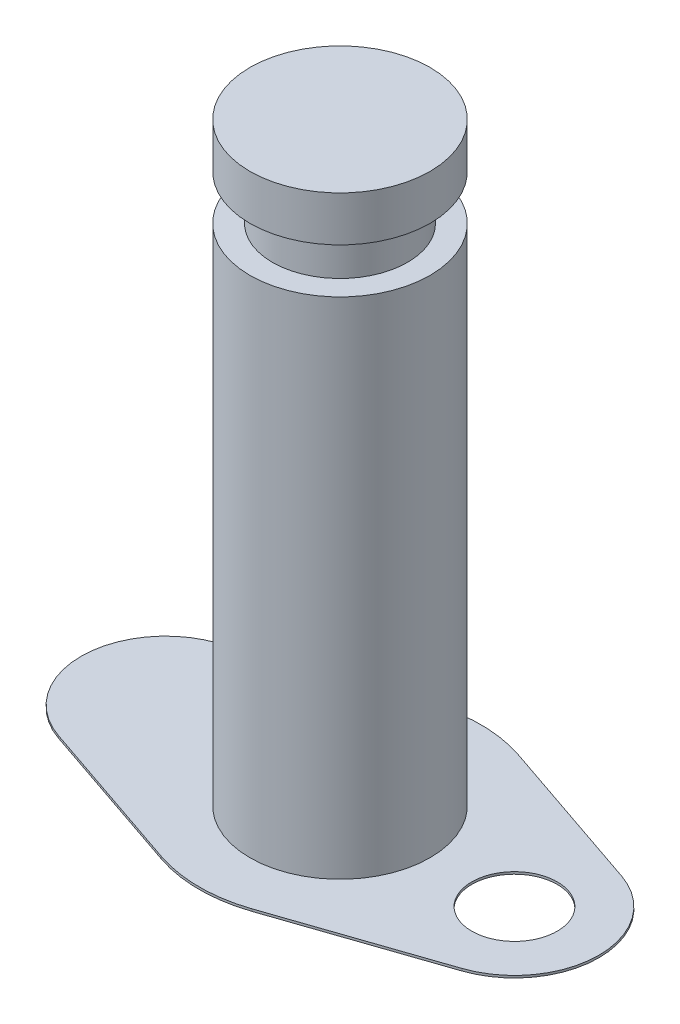
ISO-10303-21;
HEADER;
FILE_DESCRIPTION(('STEP AP214'),'2;1');
FILE_NAME('part.step','',(''),(''),'','','');
FILE_SCHEMA(('AUTOMOTIVE_DESIGN { 1 0 10303 214 1 1 1 1 }'));
ENDSEC;
DATA;
#1=APPLICATION_CONTEXT('core data for automotive mechanical design processes');
#2=APPLICATION_PROTOCOL_DEFINITION('international standard','automotive_design',2000,#1);
#3=PRODUCT_CONTEXT('',#1,'mechanical');
#4=PRODUCT('Part','Part','',(#3));
#5=PRODUCT_RELATED_PRODUCT_CATEGORY('part','',(#4));
#6=PRODUCT_DEFINITION_FORMATION('','',#4);
#7=PRODUCT_DEFINITION_CONTEXT('part definition',#1,'design');
#8=PRODUCT_DEFINITION('design','',#6,#7);
#9=PRODUCT_DEFINITION_SHAPE('','',#8);
#10=(LENGTH_UNIT() NAMED_UNIT(*) SI_UNIT(.MILLI.,.METRE.));
#11=(NAMED_UNIT(*) PLANE_ANGLE_UNIT() SI_UNIT($,.RADIAN.));
#12=(NAMED_UNIT(*) SI_UNIT($,.STERADIAN.) SOLID_ANGLE_UNIT());
#13=UNCERTAINTY_MEASURE_WITH_UNIT(LENGTH_MEASURE(1.E-05),#10,'distance_accuracy_value','');
#14=(GEOMETRIC_REPRESENTATION_CONTEXT(3) GLOBAL_UNCERTAINTY_ASSIGNED_CONTEXT((#13)) GLOBAL_UNIT_ASSIGNED_CONTEXT((#10,
#11,#12)) REPRESENTATION_CONTEXT('',''));
#15=CARTESIAN_POINT('',(0.,0.,0.));
#16=DIRECTION('',(0.,0.,1.));
#17=DIRECTION('',(1.,0.,0.));
#18=AXIS2_PLACEMENT_3D('',#15,#16,#17);
#19=CARTESIAN_POINT('',(-2.01612903225807,0.1,-5.91588739964565));
#20=DIRECTION('',(-0.32258064516129,0.,-0.946541983943304));
#21=DIRECTION('',(-0.946541983943304,0.,0.32258064516129));
#22=AXIS2_PLACEMENT_3D('',#19,#20,#21);
#23=PLANE('',#22);
#24=DIRECTION('',(0.946541983943304,0.,-0.32258064516129));
#25=VECTOR('',#24,1.);
#26=CARTESIAN_POINT('',(-2.01612903225807,0.,-5.91588739964565));
#27=LINE('',#26,#25);
#28=CARTESIAN_POINT('',(-8.95967741935484,0.,-3.54953243978739));
#29=VERTEX_POINT('',#28);
#30=CARTESIAN_POINT('',(-2.01612903225806,0.,-5.91588739964565));
#31=VERTEX_POINT('',#30);
#32=EDGE_CURVE('E137',#29,#31,#27,.T.);
#33=ORIENTED_EDGE('',*,*,#32,.F.);
#34=DIRECTION('',(0.,-1.,0.));
#35=VECTOR('',#34,1.);
#36=CARTESIAN_POINT('',(-8.95967741935484,0.1,-3.54953243978739));
#37=LINE('',#36,#35);
#38=CARTESIAN_POINT('',(-8.95967741935484,0.1,-3.54953243978739));
#39=VERTEX_POINT('',#38);
#40=EDGE_CURVE('E42',#39,#29,#37,.T.);
#41=ORIENTED_EDGE('',*,*,#40,.F.);
#42=DIRECTION('',(0.946541983943304,0.,-0.32258064516129));
#43=VECTOR('',#42,1.);
#44=CARTESIAN_POINT('',(-2.01612903225807,0.1,-5.91588739964565));
#45=LINE('',#44,#43);
#46=CARTESIAN_POINT('',(-2.01612903225806,0.1,-5.91588739964565));
#47=VERTEX_POINT('',#46);
#48=EDGE_CURVE('E284',#39,#47,#45,.T.);
#49=ORIENTED_EDGE('',*,*,#48,.T.);
#50=DIRECTION('',(0.,-1.,0.));
#51=VECTOR('',#50,1.);
#52=CARTESIAN_POINT('',(-2.01612903225806,0.1,-5.91588739964565));
#53=LINE('',#52,#51);
#54=EDGE_CURVE('E92',#47,#31,#53,.T.);
#55=ORIENTED_EDGE('',*,*,#54,.T.);
#56=EDGE_LOOP('',(#33,#41,#49,#55));
#57=FACE_BOUND('',#56,.T.);
#58=ADVANCED_FACE('F39',(#57),#23,.T.);
#59=CARTESIAN_POINT('',(-7.75,0.1,0.));
#60=DIRECTION('',(0.,-1.,0.));
#61=DIRECTION('',(0.,0.,-1.));
#62=AXIS2_PLACEMENT_3D('',#59,#60,#61);
#63=CYLINDRICAL_SURFACE('',#62,3.75);
#64=CARTESIAN_POINT('',(-7.75,0.,0.));
#65=DIRECTION('',(0.,1.,0.));
#66=DIRECTION('',(0.,0.,1.));
#67=AXIS2_PLACEMENT_3D('',#64,#65,#66);
#68=CIRCLE('',#67,3.75);
#69=CARTESIAN_POINT('',(-8.95967741935484,0.,3.54953243978739));
#70=VERTEX_POINT('',#69);
#71=EDGE_CURVE('E140',#29,#70,#68,.T.);
#72=ORIENTED_EDGE('',*,*,#71,.T.);
#73=DIRECTION('',(0.,-1.,0.));
#74=VECTOR('',#73,1.);
#75=CARTESIAN_POINT('',(-8.95967741935484,0.1,3.54953243978739));
#76=LINE('',#75,#74);
#77=CARTESIAN_POINT('',(-8.95967741935484,0.1,3.54953243978739));
#78=VERTEX_POINT('',#77);
#79=EDGE_CURVE('E162',#78,#70,#76,.T.);
#80=ORIENTED_EDGE('',*,*,#79,.F.);
#81=CARTESIAN_POINT('',(-7.75,0.1,0.));
#82=DIRECTION('',(0.,1.,0.));
#83=DIRECTION('',(0.,0.,1.));
#84=AXIS2_PLACEMENT_3D('',#81,#82,#83);
#85=CIRCLE('',#84,3.75);
#86=EDGE_CURVE('E171',#39,#78,#85,.T.);
#87=ORIENTED_EDGE('',*,*,#86,.F.);
#88=ORIENTED_EDGE('',*,*,#40,.T.);
#89=EDGE_LOOP('',(#72,#80,#87,#88));
#90=FACE_BOUND('',#89,.T.);
#91=ADVANCED_FACE('F170',(#90),#63,.T.);
#92=CARTESIAN_POINT('',(-2.01612903225806,0.1,5.91588739964565));
#93=DIRECTION('',(0.32258064516129,0.,-0.946541983943304));
#94=DIRECTION('',(-0.946541983943304,0.,-0.32258064516129));
#95=AXIS2_PLACEMENT_3D('',#92,#93,#94);
#96=PLANE('',#95);
#97=DIRECTION('',(0.946541983943304,0.,0.32258064516129));
#98=VECTOR('',#97,1.);
#99=CARTESIAN_POINT('',(-2.01612903225806,0.,5.91588739964565));
#100=LINE('',#99,#98);
#101=CARTESIAN_POINT('',(-2.01612903225806,0.,5.91588739964565));
#102=VERTEX_POINT('',#101);
#103=EDGE_CURVE('E143',#70,#102,#100,.T.);
#104=ORIENTED_EDGE('',*,*,#103,.T.);
#105=DIRECTION('',(0.,-1.,0.));
#106=VECTOR('',#105,1.);
#107=CARTESIAN_POINT('',(-2.01612903225806,0.1,5.91588739964565));
#108=LINE('',#107,#106);
#109=CARTESIAN_POINT('',(-2.01612903225806,0.1,5.91588739964565));
#110=VERTEX_POINT('',#109);
#111=EDGE_CURVE('E160',#110,#102,#108,.T.);
#112=ORIENTED_EDGE('',*,*,#111,.F.);
#113=DIRECTION('',(0.946541983943304,0.,0.32258064516129));
#114=VECTOR('',#113,1.);
#115=CARTESIAN_POINT('',(-2.01612903225806,0.1,5.91588739964565));
#116=LINE('',#115,#114);
#117=EDGE_CURVE('E287',#78,#110,#116,.T.);
#118=ORIENTED_EDGE('',*,*,#117,.F.);
#119=ORIENTED_EDGE('',*,*,#79,.T.);
#120=EDGE_LOOP('',(#104,#112,#118,#119));
#121=FACE_BOUND('',#120,.T.);
#122=ADVANCED_FACE('F179',(#121),#96,.F.);
#123=CARTESIAN_POINT('',(0.,0.1,0.));
#124=DIRECTION('',(0.,-1.,0.));
#125=DIRECTION('',(0.,0.,-1.));
#126=AXIS2_PLACEMENT_3D('',#123,#124,#125);
#127=CYLINDRICAL_SURFACE('',#126,6.25);
#128=CARTESIAN_POINT('',(0.,0.,0.));
#129=DIRECTION('',(0.,1.,0.));
#130=DIRECTION('',(0.,0.,1.));
#131=AXIS2_PLACEMENT_3D('',#128,#129,#130);
#132=CIRCLE('',#131,6.25);
#133=CARTESIAN_POINT('',(2.01612903225806,0.,5.91588739964565));
#134=VERTEX_POINT('',#133);
#135=EDGE_CURVE('E145',#102,#134,#132,.T.);
#136=ORIENTED_EDGE('',*,*,#135,.T.);
#137=DIRECTION('',(0.,-1.,0.));
#138=VECTOR('',#137,1.);
#139=CARTESIAN_POINT('',(2.01612903225806,0.1,5.91588739964565));
#140=LINE('',#139,#138);
#141=CARTESIAN_POINT('',(2.01612903225806,0.1,5.91588739964565));
#142=VERTEX_POINT('',#141);
#143=EDGE_CURVE('E158',#142,#134,#140,.T.);
#144=ORIENTED_EDGE('',*,*,#143,.F.);
#145=CARTESIAN_POINT('',(0.,0.1,0.));
#146=DIRECTION('',(0.,1.,0.));
#147=DIRECTION('',(0.,0.,1.));
#148=AXIS2_PLACEMENT_3D('',#145,#146,#147);
#149=CIRCLE('',#148,6.25);
#150=EDGE_CURVE('E134',#110,#142,#149,.T.);
#151=ORIENTED_EDGE('',*,*,#150,.F.);
#152=ORIENTED_EDGE('',*,*,#111,.T.);
#153=EDGE_LOOP('',(#136,#144,#151,#152));
#154=FACE_BOUND('',#153,.T.);
#155=ADVANCED_FACE('F183',(#154),#127,.T.);
#156=CARTESIAN_POINT('',(2.01612903225806,0.1,5.91588739964565));
#157=DIRECTION('',(0.32258064516129,0.,0.946541983943304));
#158=DIRECTION('',(0.946541983943304,0.,-0.32258064516129));
#159=AXIS2_PLACEMENT_3D('',#156,#157,#158);
#160=PLANE('',#159);
#161=DIRECTION('',(-0.946541983943304,0.,0.32258064516129));
#162=VECTOR('',#161,1.);
#163=CARTESIAN_POINT('',(2.01612903225806,0.,5.91588739964565));
#164=LINE('',#163,#162);
#165=CARTESIAN_POINT('',(8.95967741935484,0.,3.54953243978739));
#166=VERTEX_POINT('',#165);
#167=EDGE_CURVE('E148',#166,#134,#164,.T.);
#168=ORIENTED_EDGE('',*,*,#167,.F.);
#169=DIRECTION('',(0.,-1.,0.));
#170=VECTOR('',#169,1.);
#171=CARTESIAN_POINT('',(8.95967741935484,0.1,3.54953243978739));
#172=LINE('',#171,#170);
#173=CARTESIAN_POINT('',(8.95967741935484,0.1,3.54953243978739));
#174=VERTEX_POINT('',#173);
#175=EDGE_CURVE('E129',#174,#166,#172,.T.);
#176=ORIENTED_EDGE('',*,*,#175,.F.);
#177=DIRECTION('',(-0.946541983943304,0.,0.32258064516129));
#178=VECTOR('',#177,1.);
#179=CARTESIAN_POINT('',(2.01612903225806,0.1,5.91588739964565));
#180=LINE('',#179,#178);
#181=EDGE_CURVE('E118',#174,#142,#180,.T.);
#182=ORIENTED_EDGE('',*,*,#181,.T.);
#183=ORIENTED_EDGE('',*,*,#143,.T.);
#184=EDGE_LOOP('',(#168,#176,#182,#183));
#185=FACE_BOUND('',#184,.T.);
#186=ADVANCED_FACE('F186',(#185),#160,.T.);
#187=CARTESIAN_POINT('',(7.75,0.1,0.));
#188=DIRECTION('',(0.,-1.,0.));
#189=DIRECTION('',(0.,0.,-1.));
#190=AXIS2_PLACEMENT_3D('',#187,#188,#189);
#191=CYLINDRICAL_SURFACE('',#190,3.75);
#192=CARTESIAN_POINT('',(7.75,0.,0.));
#193=DIRECTION('',(0.,1.,0.));
#194=DIRECTION('',(0.,0.,1.));
#195=AXIS2_PLACEMENT_3D('',#192,#193,#194);
#196=CIRCLE('',#195,3.75);
#197=CARTESIAN_POINT('',(8.95967741935484,0.,-3.54953243978739));
#198=VERTEX_POINT('',#197);
#199=EDGE_CURVE('E125',#166,#198,#196,.T.);
#200=ORIENTED_EDGE('',*,*,#199,.T.);
#201=DIRECTION('',(0.,-1.,0.));
#202=VECTOR('',#201,1.);
#203=CARTESIAN_POINT('',(8.95967741935484,0.1,-3.54953243978739));
#204=LINE('',#203,#202);
#205=CARTESIAN_POINT('',(8.95967741935484,0.1,-3.54953243978739));
#206=VERTEX_POINT('',#205);
#207=EDGE_CURVE('E122',#206,#198,#204,.T.);
#208=ORIENTED_EDGE('',*,*,#207,.F.);
#209=CARTESIAN_POINT('',(7.75,0.1,0.));
#210=DIRECTION('',(0.,1.,0.));
#211=DIRECTION('',(0.,0.,1.));
#212=AXIS2_PLACEMENT_3D('',#209,#210,#211);
#213=CIRCLE('',#212,3.75);
#214=EDGE_CURVE('E112',#174,#206,#213,.T.);
#215=ORIENTED_EDGE('',*,*,#214,.F.);
#216=ORIENTED_EDGE('',*,*,#175,.T.);
#217=EDGE_LOOP('',(#200,#208,#215,#216));
#218=FACE_BOUND('',#217,.T.);
#219=ADVANCED_FACE('F123',(#218),#191,.T.);
#220=CARTESIAN_POINT('',(2.01612903225807,0.1,-5.91588739964565));
#221=DIRECTION('',(0.32258064516129,0.,-0.946541983943304));
#222=DIRECTION('',(-0.946541983943304,0.,-0.32258064516129));
#223=AXIS2_PLACEMENT_3D('',#220,#221,#222);
#224=PLANE('',#223);
#225=DIRECTION('',(0.946541983943304,0.,0.32258064516129));
#226=VECTOR('',#225,1.);
#227=CARTESIAN_POINT('',(2.01612903225807,0.,-5.91588739964565));
#228=LINE('',#227,#226);
#229=CARTESIAN_POINT('',(2.01612903225806,0.,-5.91588739964565));
#230=VERTEX_POINT('',#229);
#231=EDGE_CURVE('E153',#230,#198,#228,.T.);
#232=ORIENTED_EDGE('',*,*,#231,.F.);
#233=DIRECTION('',(0.,-1.,0.));
#234=VECTOR('',#233,1.);
#235=CARTESIAN_POINT('',(2.01612903225806,0.1,-5.91588739964565));
#236=LINE('',#235,#234);
#237=CARTESIAN_POINT('',(2.01612903225806,0.1,-5.91588739964565));
#238=VERTEX_POINT('',#237);
#239=EDGE_CURVE('E85',#238,#230,#236,.T.);
#240=ORIENTED_EDGE('',*,*,#239,.F.);
#241=DIRECTION('',(0.946541983943304,0.,0.32258064516129));
#242=VECTOR('',#241,1.);
#243=CARTESIAN_POINT('',(2.01612903225807,0.1,-5.91588739964565));
#244=LINE('',#243,#242);
#245=EDGE_CURVE('E116',#238,#206,#244,.T.);
#246=ORIENTED_EDGE('',*,*,#245,.T.);
#247=ORIENTED_EDGE('',*,*,#207,.T.);
#248=EDGE_LOOP('',(#232,#240,#246,#247));
#249=FACE_BOUND('',#248,.T.);
#250=ADVANCED_FACE('F131',(#249),#224,.T.);
#251=EDGE_CURVE('E149',#230,#31,#132,.T.);
#252=ORIENTED_EDGE('',*,*,#251,.T.);
#253=ORIENTED_EDGE('',*,*,#54,.F.);
#254=EDGE_CURVE('E56',#238,#47,#149,.T.);
#255=ORIENTED_EDGE('',*,*,#254,.F.);
#256=ORIENTED_EDGE('',*,*,#239,.T.);
#257=EDGE_LOOP('',(#252,#253,#255,#256));
#258=FACE_BOUND('',#257,.T.);
#259=ADVANCED_FACE('F194',(#258),#127,.T.);
#260=CARTESIAN_POINT('',(0.,0.1,0.));
#261=DIRECTION('',(0.,1.,0.));
#262=DIRECTION('',(0.,0.,1.));
#263=AXIS2_PLACEMENT_3D('',#260,#261,#262);
#264=PLANE('',#263);
#265=CARTESIAN_POINT('',(7.75,0.100000000000001,0.));
#266=DIRECTION('',(0.,1.,0.));
#267=DIRECTION('',(0.,0.,1.));
#268=AXIS2_PLACEMENT_3D('',#265,#266,#267);
#269=CIRCLE('',#268,1.89864999999999);
#270=CARTESIAN_POINT('',(7.75,0.100000000000001,1.89864999999999));
#271=VERTEX_POINT('',#270);
#272=EDGE_CURVE('E256',#271,#271,#269,.T.);
#273=ORIENTED_EDGE('',*,*,#272,.F.);
#274=EDGE_LOOP('',(#273));
#275=FACE_BOUND('',#274,.T.);
#276=CARTESIAN_POINT('',(0.,0.0999999999999994,0.));
#277=DIRECTION('',(0.,1.,0.));
#278=DIRECTION('',(0.,0.,1.));
#279=AXIS2_PLACEMENT_3D('',#276,#277,#278);
#280=CIRCLE('',#279,4.);
#281=CARTESIAN_POINT('',(0.,0.0999999999999994,-4.));
#282=VERTEX_POINT('',#281);
#283=EDGE_CURVE('E141',#282,#282,#280,.F.);
#284=ORIENTED_EDGE('',*,*,#283,.T.);
#285=EDGE_LOOP('',(#284));
#286=FACE_BOUND('',#285,.T.);
#287=ORIENTED_EDGE('',*,*,#48,.F.);
#288=ORIENTED_EDGE('',*,*,#86,.T.);
#289=ORIENTED_EDGE('',*,*,#117,.T.);
#290=ORIENTED_EDGE('',*,*,#150,.T.);
#291=ORIENTED_EDGE('',*,*,#181,.F.);
#292=ORIENTED_EDGE('',*,*,#214,.T.);
#293=ORIENTED_EDGE('',*,*,#245,.F.);
#294=ORIENTED_EDGE('',*,*,#254,.T.);
#295=EDGE_LOOP('',(#287,#288,#289,#290,#291,#292,#293,#294));
#296=FACE_BOUND('',#295,.T.);
#297=ADVANCED_FACE('F114',(#275,#286,#296),#264,.T.);
#298=CARTESIAN_POINT('',(0.,0.,0.));
#299=DIRECTION('',(0.,1.,0.));
#300=DIRECTION('',(0.,0.,1.));
#301=AXIS2_PLACEMENT_3D('',#298,#299,#300);
#302=PLANE('',#301);
#303=CARTESIAN_POINT('',(7.75,0.,0.));
#304=DIRECTION('',(0.,1.,0.));
#305=DIRECTION('',(0.,0.,1.));
#306=AXIS2_PLACEMENT_3D('',#303,#304,#305);
#307=CIRCLE('',#306,1.89865);
#308=CARTESIAN_POINT('',(7.75,0.,1.89865));
#309=VERTEX_POINT('',#308);
#310=EDGE_CURVE('E261',#309,#309,#307,.T.);
#311=ORIENTED_EDGE('',*,*,#310,.T.);
#312=EDGE_LOOP('',(#311));
#313=FACE_BOUND('',#312,.T.);
#314=CARTESIAN_POINT('',(0.,0.,0.));
#315=DIRECTION('',(0.,1.,0.));
#316=DIRECTION('',(0.,0.,1.));
#317=AXIS2_PLACEMENT_3D('',#314,#315,#316);
#318=CIRCLE('',#317,1.89865);
#319=CARTESIAN_POINT('',(0.,0.,1.89865));
#320=VERTEX_POINT('',#319);
#321=EDGE_CURVE('E267',#320,#320,#318,.T.);
#322=ORIENTED_EDGE('',*,*,#321,.T.);
#323=EDGE_LOOP('',(#322));
#324=FACE_BOUND('',#323,.T.);
#325=ORIENTED_EDGE('',*,*,#32,.T.);
#326=ORIENTED_EDGE('',*,*,#251,.F.);
#327=ORIENTED_EDGE('',*,*,#231,.T.);
#328=ORIENTED_EDGE('',*,*,#199,.F.);
#329=ORIENTED_EDGE('',*,*,#167,.T.);
#330=ORIENTED_EDGE('',*,*,#135,.F.);
#331=ORIENTED_EDGE('',*,*,#103,.F.);
#332=ORIENTED_EDGE('',*,*,#71,.F.);
#333=EDGE_LOOP('',(#325,#326,#327,#328,#329,#330,#331,#332));
#334=FACE_BOUND('',#333,.T.);
#335=ADVANCED_FACE('F173',(#313,#324,#334),#302,.F.);
#336=CARTESIAN_POINT('',(0.,22.5,0.));
#337=DIRECTION('',(0.,-1.,0.));
#338=DIRECTION('',(0.,0.,-1.));
#339=AXIS2_PLACEMENT_3D('',#336,#337,#338);
#340=CYLINDRICAL_SURFACE('',#339,4.);
#341=CARTESIAN_POINT('',(0.,22.5,0.));
#342=DIRECTION('',(0.,1.,0.));
#343=DIRECTION('',(0.,0.,1.));
#344=AXIS2_PLACEMENT_3D('',#341,#342,#343);
#345=CIRCLE('',#344,4.);
#346=CARTESIAN_POINT('',(0.,22.5,-4.));
#347=VERTEX_POINT('',#346);
#348=EDGE_CURVE('E278',#347,#347,#345,.T.);
#349=CARTESIAN_POINT('',(0.,0.0999999999999994,-4.));
#350=CARTESIAN_POINT('',(0.,0.333333333333332,-4.));
#351=CARTESIAN_POINT('',(0.,0.566666666666666,-4.));
#352=CARTESIAN_POINT('',(0.,1.03333333333333,-4.));
#353=CARTESIAN_POINT('',(0.,1.26666666666666,-4.));
#354=CARTESIAN_POINT('',(0.,1.73333333333333,-4.));
#355=CARTESIAN_POINT('',(0.,1.96666666666667,-4.));
#356=CARTESIAN_POINT('',(0.,2.43333333333333,-4.));
#357=CARTESIAN_POINT('',(0.,2.66666666666667,-4.));
#358=CARTESIAN_POINT('',(0.,3.13333333333333,-4.));
#359=CARTESIAN_POINT('',(0.,3.36666666666667,-4.));
#360=CARTESIAN_POINT('',(0.,3.83333333333333,-4.));
#361=CARTESIAN_POINT('',(0.,4.06666666666667,-4.));
#362=CARTESIAN_POINT('',(0.,4.53333333333333,-4.));
#363=CARTESIAN_POINT('',(0.,4.76666666666667,-4.));
#364=CARTESIAN_POINT('',(0.,5.23333333333333,-4.));
#365=CARTESIAN_POINT('',(0.,5.46666666666667,-4.));
#366=CARTESIAN_POINT('',(0.,5.93333333333333,-4.));
#367=CARTESIAN_POINT('',(0.,6.16666666666667,-4.));
#368=CARTESIAN_POINT('',(0.,6.63333333333333,-4.));
#369=CARTESIAN_POINT('',(0.,6.86666666666666,-4.));
#370=CARTESIAN_POINT('',(0.,7.33333333333333,-4.));
#371=CARTESIAN_POINT('',(0.,7.56666666666666,-4.));
#372=CARTESIAN_POINT('',(0.,8.03333333333333,-4.));
#373=CARTESIAN_POINT('',(0.,8.26666666666666,-4.));
#374=CARTESIAN_POINT('',(0.,8.73333333333333,-4.));
#375=CARTESIAN_POINT('',(0.,8.96666666666667,-4.));
#376=CARTESIAN_POINT('',(0.,9.43333333333333,-4.));
#377=CARTESIAN_POINT('',(0.,9.66666666666666,-4.));
#378=CARTESIAN_POINT('',(0.,10.1333333333333,-4.));
#379=CARTESIAN_POINT('',(0.,10.3666666666667,-4.));
#380=CARTESIAN_POINT('',(0.,10.8333333333333,-4.));
#381=CARTESIAN_POINT('',(0.,11.0666666666667,-4.));
#382=CARTESIAN_POINT('',(0.,11.5333333333333,-4.));
#383=CARTESIAN_POINT('',(0.,11.7666666666667,-4.));
#384=CARTESIAN_POINT('',(0.,12.2333333333333,-4.));
#385=CARTESIAN_POINT('',(0.,12.4666666666667,-4.));
#386=CARTESIAN_POINT('',(0.,12.9333333333333,-4.));
#387=CARTESIAN_POINT('',(0.,13.1666666666667,-4.));
#388=CARTESIAN_POINT('',(0.,13.6333333333333,-4.));
#389=CARTESIAN_POINT('',(0.,13.8666666666667,-4.));
#390=CARTESIAN_POINT('',(0.,14.3333333333333,-4.));
#391=CARTESIAN_POINT('',(0.,14.5666666666667,-4.));
#392=CARTESIAN_POINT('',(0.,15.0333333333333,-4.));
#393=CARTESIAN_POINT('',(0.,15.2666666666667,-4.));
#394=CARTESIAN_POINT('',(0.,15.7333333333333,-4.));
#395=CARTESIAN_POINT('',(0.,15.9666666666667,-4.));
#396=CARTESIAN_POINT('',(0.,16.4333333333333,-4.));
#397=CARTESIAN_POINT('',(0.,16.6666666666667,-4.));
#398=CARTESIAN_POINT('',(0.,17.1333333333333,-4.));
#399=CARTESIAN_POINT('',(0.,17.3666666666667,-4.));
#400=CARTESIAN_POINT('',(0.,17.8333333333333,-4.));
#401=CARTESIAN_POINT('',(0.,18.0666666666667,-4.));
#402=CARTESIAN_POINT('',(0.,18.5333333333333,-4.));
#403=CARTESIAN_POINT('',(0.,18.7666666666667,-4.));
#404=CARTESIAN_POINT('',(0.,19.2333333333333,-4.));
#405=CARTESIAN_POINT('',(0.,19.4666666666667,-4.));
#406=CARTESIAN_POINT('',(0.,19.9333333333333,-4.));
#407=CARTESIAN_POINT('',(0.,20.1666666666667,-4.));
#408=CARTESIAN_POINT('',(0.,20.6333333333333,-4.));
#409=CARTESIAN_POINT('',(0.,20.8666666666667,-4.));
#410=CARTESIAN_POINT('',(0.,21.3333333333333,-4.));
#411=CARTESIAN_POINT('',(0.,21.5666666666667,-4.));
#412=CARTESIAN_POINT('',(0.,22.0333333333333,-4.));
#413=CARTESIAN_POINT('',(0.,22.2666666666667,-4.));
#414=CARTESIAN_POINT('',(0.,22.5,-4.));
#415=B_SPLINE_CURVE_WITH_KNOTS('',3,(#349,#350,#351,#352,#353,#354,#355,#356,#357,#358,#359,
#360,#361,#362,#363,#364,#365,#366,#367,#368,#369,#370,#371,#372,#373,#374,#375,#376,#377,#378,
#379,#380,#381,#382,#383,#384,#385,#386,#387,#388,#389,#390,#391,#392,#393,#394,#395,#396,#397,
#398,#399,#400,#401,#402,#403,#404,#405,#406,#407,#408,#409,#410,#411,#412,#413,#414),
.UNSPECIFIED.,.F.,.F.,(4,2,2,2,2,2,2,2,2,2,2,2,2,2,2,2,2,2,2,2,2,2,2,2,2,2,2,2,2,2,2,2,4),(0.,
0.699999999999999,1.4,2.1,2.8,3.5,4.2,4.9,5.6,6.3,7.,7.7,8.4,9.1,9.8,10.5,11.2,11.9,12.6,13.3,
14.,14.7,15.4,16.1,16.8,17.5,18.2,18.9,19.6,20.3,21.,21.7,22.4),.UNSPECIFIED.);
#416=EDGE_CURVE('BSEAM199',#282,#347,#415,.T.);
#417=ORIENTED_EDGE('',*,*,#283,.F.);
#418=ORIENTED_EDGE('',*,*,#348,.F.);
#419=ORIENTED_EDGE('',*,*,#416,.T.);
#420=ORIENTED_EDGE('',*,*,#416,.F.);
#421=EDGE_LOOP('',(#417,#419,#418,#420));
#422=FACE_BOUND('',#421,.T.);
#423=ADVANCED_FACE('F199',(#422),#340,.T.);
#424=CARTESIAN_POINT('',(0.,22.5,0.));
#425=DIRECTION('',(0.,1.,0.));
#426=DIRECTION('',(0.,0.,1.));
#427=AXIS2_PLACEMENT_3D('',#424,#425,#426);
#428=PLANE('',#427);
#429=CARTESIAN_POINT('',(0.,22.5,0.));
#430=DIRECTION('',(0.,1.,0.));
#431=DIRECTION('',(0.,0.,1.));
#432=AXIS2_PLACEMENT_3D('',#429,#430,#431);
#433=CIRCLE('',#432,3.);
#434=CARTESIAN_POINT('',(0.,22.5,3.));
#435=VERTEX_POINT('',#434);
#436=EDGE_CURVE('E11',#435,#435,#433,.T.);
#437=ORIENTED_EDGE('',*,*,#436,.F.);
#438=EDGE_LOOP('',(#437));
#439=FACE_BOUND('',#438,.T.);
#440=ORIENTED_EDGE('',*,*,#348,.T.);
#441=EDGE_LOOP('',(#440));
#442=FACE_BOUND('',#441,.T.);
#443=ADVANCED_FACE('F206',(#439,#442),#428,.T.);
#444=CARTESIAN_POINT('',(0.,24.5,0.));
#445=DIRECTION('',(0.,-1.,0.));
#446=DIRECTION('',(0.,0.,-1.));
#447=AXIS2_PLACEMENT_3D('',#444,#445,#446);
#448=CYLINDRICAL_SURFACE('',#447,3.);
#449=CARTESIAN_POINT('',(0.,24.5,0.));
#450=DIRECTION('',(0.,1.,0.));
#451=DIRECTION('',(0.,0.,1.));
#452=AXIS2_PLACEMENT_3D('',#449,#450,#451);
#453=CIRCLE('',#452,3.);
#454=CARTESIAN_POINT('',(0.,24.5,3.));
#455=VERTEX_POINT('',#454);
#456=EDGE_CURVE('E274',#455,#455,#453,.T.);
#457=ORIENTED_EDGE('',*,*,#456,.F.);
#458=EDGE_LOOP('',(#457));
#459=FACE_BOUND('',#458,.T.);
#460=ORIENTED_EDGE('',*,*,#436,.T.);
#461=EDGE_LOOP('',(#460));
#462=FACE_BOUND('',#461,.T.);
#463=ADVANCED_FACE('F210',(#459,#462),#448,.T.);
#464=CARTESIAN_POINT('',(0.,26.5,0.));
#465=DIRECTION('',(0.,-1.,0.));
#466=DIRECTION('',(0.,0.,-1.));
#467=AXIS2_PLACEMENT_3D('',#464,#465,#466);
#468=CYLINDRICAL_SURFACE('',#467,4.);
#469=CARTESIAN_POINT('',(0.,26.5,0.));
#470=DIRECTION('',(0.,1.,0.));
#471=DIRECTION('',(0.,0.,1.));
#472=AXIS2_PLACEMENT_3D('',#469,#470,#471);
#473=CIRCLE('',#472,4.);
#474=CARTESIAN_POINT('',(0.,26.5,4.));
#475=VERTEX_POINT('',#474);
#476=EDGE_CURVE('E271',#475,#475,#473,.T.);
#477=ORIENTED_EDGE('',*,*,#476,.F.);
#478=EDGE_LOOP('',(#477));
#479=FACE_BOUND('',#478,.T.);
#480=CARTESIAN_POINT('',(0.,24.5,0.));
#481=DIRECTION('',(0.,1.,0.));
#482=DIRECTION('',(0.,0.,1.));
#483=AXIS2_PLACEMENT_3D('',#480,#481,#482);
#484=CIRCLE('',#483,4.);
#485=CARTESIAN_POINT('',(0.,24.5,4.));
#486=VERTEX_POINT('',#485);
#487=EDGE_CURVE('E270',#486,#486,#484,.T.);
#488=ORIENTED_EDGE('',*,*,#487,.T.);
#489=EDGE_LOOP('',(#488));
#490=FACE_BOUND('',#489,.T.);
#491=ADVANCED_FACE('F214',(#479,#490),#468,.T.);
#492=CARTESIAN_POINT('',(0.,26.5,0.));
#493=DIRECTION('',(0.,1.,0.));
#494=DIRECTION('',(0.,0.,1.));
#495=AXIS2_PLACEMENT_3D('',#492,#493,#494);
#496=PLANE('',#495);
#497=ORIENTED_EDGE('',*,*,#476,.T.);
#498=EDGE_LOOP('',(#497));
#499=FACE_BOUND('',#498,.T.);
#500=ADVANCED_FACE('F218',(#499),#496,.T.);
#501=CARTESIAN_POINT('',(0.,24.5,0.));
#502=DIRECTION('',(0.,1.,0.));
#503=DIRECTION('',(0.,0.,1.));
#504=AXIS2_PLACEMENT_3D('',#501,#502,#503);
#505=PLANE('',#504);
#506=ORIENTED_EDGE('',*,*,#456,.T.);
#507=EDGE_LOOP('',(#506));
#508=FACE_BOUND('',#507,.T.);
#509=ORIENTED_EDGE('',*,*,#487,.F.);
#510=EDGE_LOOP('',(#509));
#511=FACE_BOUND('',#510,.T.);
#512=ADVANCED_FACE('F220',(#508,#511),#505,.F.);
#513=CARTESIAN_POINT('',(1.89864999999999,0.100000000000001,0.));
#514=DIRECTION('',(0.,1.,0.));
#515=DIRECTION('',(0.,0.,1.));
#516=AXIS2_PLACEMENT_3D('',#513,#514,#515);
#517=PLANE('',#516);
#518=CARTESIAN_POINT('',(0.,0.0999999999999993,0.));
#519=DIRECTION('',(0.,-1.,0.));
#520=DIRECTION('',(0.,0.,-1.));
#521=AXIS2_PLACEMENT_3D('',#518,#519,#520);
#522=CIRCLE('',#521,1.35254999999999);
#523=CARTESIAN_POINT('',(0.,0.0999999999999993,-1.35254999999999));
#524=VERTEX_POINT('',#523);
#525=EDGE_CURVE('E254',#524,#524,#522,.T.);
#526=ORIENTED_EDGE('',*,*,#525,.F.);
#527=EDGE_LOOP('',(#526));
#528=FACE_BOUND('',#527,.T.);
#529=CARTESIAN_POINT('',(0.,0.100000000000001,0.));
#530=DIRECTION('',(0.,1.,0.));
#531=DIRECTION('',(0.,0.,1.));
#532=AXIS2_PLACEMENT_3D('',#529,#530,#531);
#533=CIRCLE('',#532,1.89864999999999);
#534=CARTESIAN_POINT('',(0.,0.100000000000001,1.89864999999999));
#535=VERTEX_POINT('',#534);
#536=EDGE_CURVE('E264',#535,#535,#533,.T.);
#537=ORIENTED_EDGE('',*,*,#536,.F.);
#538=EDGE_LOOP('',(#537));
#539=FACE_BOUND('',#538,.T.);
#540=ADVANCED_FACE('F223',(#528,#539),#517,.F.);
#541=CARTESIAN_POINT('',(0.,0.1,0.));
#542=DIRECTION('',(0.,1.,0.));
#543=DIRECTION('',(0.,0.,1.));
#544=AXIS2_PLACEMENT_3D('',#541,#542,#543);
#545=CYLINDRICAL_SURFACE('',#544,1.89864999999999);
#546=ORIENTED_EDGE('',*,*,#321,.F.);
#547=EDGE_LOOP('',(#546));
#548=FACE_BOUND('',#547,.T.);
#549=ORIENTED_EDGE('',*,*,#536,.T.);
#550=EDGE_LOOP('',(#549));
#551=FACE_BOUND('',#550,.T.);
#552=ADVANCED_FACE('F230',(#548,#551),#545,.F.);
#553=CARTESIAN_POINT('',(7.75,0.1,0.));
#554=DIRECTION('',(0.,1.,0.));
#555=DIRECTION('',(0.,0.,1.));
#556=AXIS2_PLACEMENT_3D('',#553,#554,#555);
#557=CYLINDRICAL_SURFACE('',#556,1.89864999999999);
#558=ORIENTED_EDGE('',*,*,#310,.F.);
#559=EDGE_LOOP('',(#558));
#560=FACE_BOUND('',#559,.T.);
#561=ORIENTED_EDGE('',*,*,#272,.T.);
#562=EDGE_LOOP('',(#561));
#563=FACE_BOUND('',#562,.T.);
#564=ADVANCED_FACE('F234',(#560,#563),#557,.F.);
#565=CARTESIAN_POINT('',(0.,9.49,0.));
#566=DIRECTION('',(0.,-1.,0.));
#567=DIRECTION('',(0.,0.,-1.));
#568=AXIS2_PLACEMENT_3D('',#565,#566,#567);
#569=CONICAL_SURFACE('',#568,1.35255,1.02974425867665);
#570=CARTESIAN_POINT('',(0.,10.3026940302657,0.));
#571=VERTEX_POINT('',#570);
#572=VERTEX_LOOP('',#571);
#573=FACE_BOUND('',#572,.T.);
#574=CARTESIAN_POINT('',(0.,9.49,0.));
#575=DIRECTION('',(0.,-1.,0.));
#576=DIRECTION('',(0.,0.,-1.));
#577=AXIS2_PLACEMENT_3D('',#574,#575,#576);
#578=CIRCLE('',#577,1.35255);
#579=CARTESIAN_POINT('',(0.,9.49,-1.35255));
#580=VERTEX_POINT('',#579);
#581=EDGE_CURVE('E251',#580,#580,#578,.T.);
#582=ORIENTED_EDGE('',*,*,#581,.T.);
#583=EDGE_LOOP('',(#582));
#584=FACE_BOUND('',#583,.T.);
#585=ADVANCED_FACE('F238',(#573,#584),#569,.F.);
#586=CARTESIAN_POINT('',(0.,0.100000000000001,0.));
#587=DIRECTION('',(0.,-1.,0.));
#588=DIRECTION('',(0.,0.,-1.));
#589=AXIS2_PLACEMENT_3D('',#586,#587,#588);
#590=CYLINDRICAL_SURFACE('',#589,1.35254999999999);
#591=ORIENTED_EDGE('',*,*,#581,.F.);
#592=EDGE_LOOP('',(#591));
#593=FACE_BOUND('',#592,.T.);
#594=ORIENTED_EDGE('',*,*,#525,.T.);
#595=EDGE_LOOP('',(#594));
#596=FACE_BOUND('',#595,.T.);
#597=ADVANCED_FACE('F242',(#593,#596),#590,.F.);
#598=CLOSED_SHELL('',(#58,#91,#122,#155,#186,#219,#250,#259,#297,#335,#423,#443,#463,#491,#500,
#512,#540,#552,#564,#585,#597));
#599=MANIFOLD_SOLID_BREP('B2',#598);
#600=ADVANCED_BREP_SHAPE_REPRESENTATION('',(#18,#599),#14);
#601=SHAPE_DEFINITION_REPRESENTATION(#9,#600);
ENDSEC;
END-ISO-10303-21;
